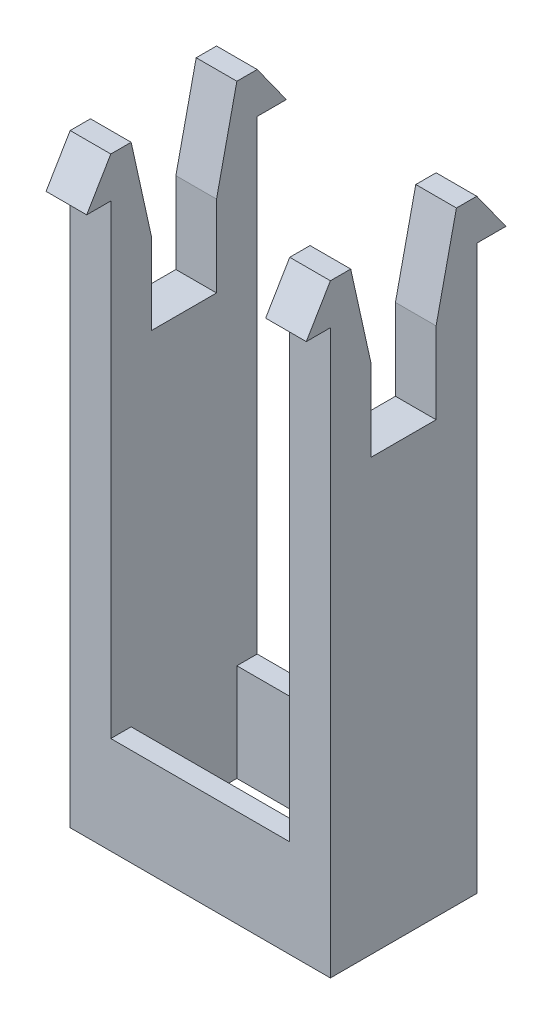
ISO-10303-21;
HEADER;
FILE_DESCRIPTION(('STEP AP214'),'2;1');
FILE_NAME('part.step','',(''),(''),'','','');
FILE_SCHEMA(('AUTOMOTIVE_DESIGN { 1 0 10303 214 1 1 1 1 }'));
ENDSEC;
DATA;
#1=APPLICATION_CONTEXT('core data for automotive mechanical design processes');
#2=APPLICATION_PROTOCOL_DEFINITION('international standard','automotive_design',2000,#1);
#3=PRODUCT_CONTEXT('',#1,'mechanical');
#4=PRODUCT('Part','Part','',(#3));
#5=PRODUCT_RELATED_PRODUCT_CATEGORY('part','',(#4));
#6=PRODUCT_DEFINITION_FORMATION('','',#4);
#7=PRODUCT_DEFINITION_CONTEXT('part definition',#1,'design');
#8=PRODUCT_DEFINITION('design','',#6,#7);
#9=PRODUCT_DEFINITION_SHAPE('','',#8);
#10=(LENGTH_UNIT() NAMED_UNIT(*) SI_UNIT(.MILLI.,.METRE.));
#11=(NAMED_UNIT(*) PLANE_ANGLE_UNIT() SI_UNIT($,.RADIAN.));
#12=(NAMED_UNIT(*) SI_UNIT($,.STERADIAN.) SOLID_ANGLE_UNIT());
#13=UNCERTAINTY_MEASURE_WITH_UNIT(LENGTH_MEASURE(1.E-05),#10,'distance_accuracy_value','');
#14=(GEOMETRIC_REPRESENTATION_CONTEXT(3) GLOBAL_UNCERTAINTY_ASSIGNED_CONTEXT((#13)) GLOBAL_UNIT_ASSIGNED_CONTEXT((#10,
#11,#12)) REPRESENTATION_CONTEXT('',''));
#15=CARTESIAN_POINT('',(0.,0.,0.));
#16=DIRECTION('',(0.,0.,1.));
#17=DIRECTION('',(1.,0.,0.));
#18=AXIS2_PLACEMENT_3D('',#15,#16,#17);
#19=CARTESIAN_POINT('',(-13.5,-2.14223492355593,1.01371710595276));
#20=DIRECTION('',(0.,-1.,0.));
#21=DIRECTION('',(0.,0.,-1.));
#22=AXIS2_PLACEMENT_3D('',#19,#20,#21);
#23=PLANE('',#22);
#24=DIRECTION('',(0.,0.,1.));
#25=VECTOR('',#24,1.);
#26=CARTESIAN_POINT('',(-13.5,-2.14223492355593,1.01371710595276));
#27=LINE('',#26,#25);
#28=CARTESIAN_POINT('',(-13.5,-2.14223492355593,2.80761665905368));
#29=VERTEX_POINT('',#28);
#30=CARTESIAN_POINT('',(-13.5,-2.14223492355593,4.05761665905367));
#31=VERTEX_POINT('',#30);
#32=EDGE_CURVE('E302',#29,#31,#27,.T.);
#33=ORIENTED_EDGE('',*,*,#32,.T.);
#34=DIRECTION('',(-1.,0.,0.));
#35=VECTOR('',#34,1.);
#36=CARTESIAN_POINT('',(-13.5,-2.14223492355593,4.05761665905367));
#37=LINE('',#36,#35);
#38=CARTESIAN_POINT('',(-2.5,-2.14223492355593,4.05761665905367));
#39=VERTEX_POINT('',#38);
#40=EDGE_CURVE('E262',#39,#31,#37,.T.);
#41=ORIENTED_EDGE('',*,*,#40,.F.);
#42=DIRECTION('',(0.,0.,1.));
#43=VECTOR('',#42,1.);
#44=CARTESIAN_POINT('',(-2.5,-2.14223492355593,1.01371710595276));
#45=LINE('',#44,#43);
#46=CARTESIAN_POINT('',(-2.5,-2.14223492355593,2.80761665905368));
#47=VERTEX_POINT('',#46);
#48=EDGE_CURVE('E298',#47,#39,#45,.T.);
#49=ORIENTED_EDGE('',*,*,#48,.F.);
#50=DIRECTION('',(-1.,0.,0.));
#51=VECTOR('',#50,1.);
#52=CARTESIAN_POINT('',(-16.,-2.14223492355593,2.80761665905368));
#53=LINE('',#52,#51);
#54=EDGE_CURVE('E348',#47,#29,#53,.T.);
#55=ORIENTED_EDGE('',*,*,#54,.T.);
#56=EDGE_LOOP('',(#33,#41,#49,#55));
#57=FACE_BOUND('',#56,.T.);
#58=ADVANCED_FACE('F33',(#57),#23,.F.);
#59=CARTESIAN_POINT('',(-16.,26.4827651722441,0.));
#60=DIRECTION('',(0.,1.,0.));
#61=DIRECTION('',(0.,0.,1.));
#62=AXIS2_PLACEMENT_3D('',#59,#60,#61);
#63=PLANE('',#62);
#64=DIRECTION('',(1.,0.,0.));
#65=VECTOR('',#64,1.);
#66=CARTESIAN_POINT('',(-16.,26.4827651722441,1.01371710595276));
#67=LINE('',#66,#65);
#68=CARTESIAN_POINT('',(-16.,26.4827651722441,1.01371710595276));
#69=VERTEX_POINT('',#68);
#70=CARTESIAN_POINT('',(-13.5,26.4827651722441,1.01371710595276));
#71=VERTEX_POINT('',#70);
#72=EDGE_CURVE('E465',#69,#71,#67,.T.);
#73=ORIENTED_EDGE('',*,*,#72,.T.);
#74=DIRECTION('',(0.,0.,1.));
#75=VECTOR('',#74,1.);
#76=CARTESIAN_POINT('',(-13.5,26.4827651722441,0.));
#77=LINE('',#76,#75);
#78=CARTESIAN_POINT('',(-13.5,26.4827651722441,2.80761665905367));
#79=VERTEX_POINT('',#78);
#80=EDGE_CURVE('E326',#71,#79,#77,.T.);
#81=ORIENTED_EDGE('',*,*,#80,.T.);
#82=DIRECTION('',(1.,0.,0.));
#83=VECTOR('',#82,1.);
#84=CARTESIAN_POINT('',(-16.,26.4827651722441,2.80761665905367));
#85=LINE('',#84,#83);
#86=CARTESIAN_POINT('',(-16.,26.4827651722441,2.80761665905367));
#87=VERTEX_POINT('',#86);
#88=EDGE_CURVE('E424',#87,#79,#85,.T.);
#89=ORIENTED_EDGE('',*,*,#88,.F.);
#90=DIRECTION('',(0.,0.,1.));
#91=VECTOR('',#90,1.);
#92=CARTESIAN_POINT('',(-16.,26.4827651722441,0.));
#93=LINE('',#92,#91);
#94=EDGE_CURVE('E351',#69,#87,#93,.T.);
#95=ORIENTED_EDGE('',*,*,#94,.F.);
#96=EDGE_LOOP('',(#73,#81,#89,#95));
#97=FACE_BOUND('',#96,.T.);
#98=ADVANCED_FACE('F525',(#97),#63,.F.);
#99=CARTESIAN_POINT('',(-16.,26.4827651722441,0.));
#100=DIRECTION('',(0.,-1.,0.));
#101=DIRECTION('',(0.,0.,-1.));
#102=AXIS2_PLACEMENT_3D('',#99,#100,#101);
#103=PLANE('',#102);
#104=DIRECTION('',(0.,0.,-1.));
#105=VECTOR('',#104,1.);
#106=CARTESIAN_POINT('',(-13.5,26.4827651722441,0.));
#107=LINE('',#106,#105);
#108=CARTESIAN_POINT('',(-13.5,26.4827651722441,13.2888140391797));
#109=VERTEX_POINT('',#108);
#110=CARTESIAN_POINT('',(-13.5,26.4827651722441,11.8076166590537));
#111=VERTEX_POINT('',#110);
#112=EDGE_CURVE('E343',#109,#111,#107,.T.);
#113=ORIENTED_EDGE('',*,*,#112,.F.);
#114=DIRECTION('',(1.,0.,0.));
#115=VECTOR('',#114,1.);
#116=CARTESIAN_POINT('',(-16.,26.4827651722441,13.2888140391797));
#117=LINE('',#116,#115);
#118=CARTESIAN_POINT('',(-16.,26.4827651722441,13.2888140391797));
#119=VERTEX_POINT('',#118);
#120=EDGE_CURVE('E437',#119,#109,#117,.T.);
#121=ORIENTED_EDGE('',*,*,#120,.F.);
#122=DIRECTION('',(0.,0.,-1.));
#123=VECTOR('',#122,1.);
#124=CARTESIAN_POINT('',(-16.,26.4827651722441,0.));
#125=LINE('',#124,#123);
#126=CARTESIAN_POINT('',(-16.,26.4827651722441,11.8076166590537));
#127=VERTEX_POINT('',#126);
#128=EDGE_CURVE('E375',#119,#127,#125,.T.);
#129=ORIENTED_EDGE('',*,*,#128,.T.);
#130=DIRECTION('',(1.,0.,0.));
#131=VECTOR('',#130,1.);
#132=CARTESIAN_POINT('',(-16.,26.4827651722441,11.8076166590537));
#133=LINE('',#132,#131);
#134=EDGE_CURVE('E433',#127,#111,#133,.T.);
#135=ORIENTED_EDGE('',*,*,#134,.T.);
#136=EDGE_LOOP('',(#113,#121,#129,#135));
#137=FACE_BOUND('',#136,.T.);
#138=ADVANCED_FACE('F484',(#137),#103,.T.);
#139=CARTESIAN_POINT('',(-16.,12.7085303062226,21.4497582778963));
#140=DIRECTION('',(0.,0.509730029609759,0.860334409932576));
#141=DIRECTION('',(0.,-0.860334409932576,0.509730029609759));
#142=AXIS2_PLACEMENT_3D('',#139,#140,#141);
#143=PLANE('',#142);
#144=DIRECTION('',(0.,-0.860334409932576,0.509730029609759));
#145=VECTOR('',#144,1.);
#146=CARTESIAN_POINT('',(-13.5,12.7085303062226,21.4497582778963));
#147=LINE('',#146,#145);
#148=CARTESIAN_POINT('',(-13.5,28.9827651722441,11.8076166590537));
#149=VERTEX_POINT('',#148);
#150=EDGE_CURVE('E341',#149,#109,#147,.T.);
#151=ORIENTED_EDGE('',*,*,#150,.F.);
#152=DIRECTION('',(1.,0.,0.));
#153=VECTOR('',#152,1.);
#154=CARTESIAN_POINT('',(-16.,28.9827651722441,11.8076166590537));
#155=LINE('',#154,#153);
#156=CARTESIAN_POINT('',(-16.,28.9827651722441,11.8076166590537));
#157=VERTEX_POINT('',#156);
#158=EDGE_CURVE('E441',#157,#149,#155,.T.);
#159=ORIENTED_EDGE('',*,*,#158,.F.);
#160=DIRECTION('',(0.,-0.860334409932576,0.509730029609759));
#161=VECTOR('',#160,1.);
#162=CARTESIAN_POINT('',(-16.,12.7085303062226,21.4497582778963));
#163=LINE('',#162,#161);
#164=EDGE_CURVE('E372',#157,#119,#163,.T.);
#165=ORIENTED_EDGE('',*,*,#164,.T.);
#166=ORIENTED_EDGE('',*,*,#120,.T.);
#167=EDGE_LOOP('',(#151,#159,#165,#166));
#168=FACE_BOUND('',#167,.T.);
#169=ADVANCED_FACE('F487',(#168),#143,.T.);
#170=CARTESIAN_POINT('',(-16.,28.9827651722441,0.));
#171=DIRECTION('',(0.,1.,0.));
#172=DIRECTION('',(0.,0.,1.));
#173=AXIS2_PLACEMENT_3D('',#170,#171,#172);
#174=PLANE('',#173);
#175=DIRECTION('',(0.,0.,1.));
#176=VECTOR('',#175,1.);
#177=CARTESIAN_POINT('',(-13.5,28.9827651722441,1.01371710595276));
#178=LINE('',#177,#176);
#179=CARTESIAN_POINT('',(-13.5,28.9827651722441,10.5576166590537));
#180=VERTEX_POINT('',#179);
#181=EDGE_CURVE('E291',#180,#149,#178,.T.);
#182=ORIENTED_EDGE('',*,*,#181,.F.);
#183=DIRECTION('',(1.,0.,0.));
#184=VECTOR('',#183,1.);
#185=CARTESIAN_POINT('',(-16.,28.9827651722441,10.5576166590537));
#186=LINE('',#185,#184);
#187=CARTESIAN_POINT('',(-16.,28.9827651722441,10.5576166590537));
#188=VERTEX_POINT('',#187);
#189=EDGE_CURVE('E445',#188,#180,#186,.T.);
#190=ORIENTED_EDGE('',*,*,#189,.F.);
#191=DIRECTION('',(0.,0.,1.));
#192=VECTOR('',#191,1.);
#193=CARTESIAN_POINT('',(-16.,28.9827651722441,0.));
#194=LINE('',#193,#192);
#195=EDGE_CURVE('E369',#188,#157,#194,.T.);
#196=ORIENTED_EDGE('',*,*,#195,.T.);
#197=ORIENTED_EDGE('',*,*,#158,.T.);
#198=EDGE_LOOP('',(#182,#190,#196,#197));
#199=FACE_BOUND('',#198,.T.);
#200=ADVANCED_FACE('F494',(#199),#174,.T.);
#201=CARTESIAN_POINT('',(-16.,-0.874345158644692,3.95200860426726));
#202=DIRECTION('',(0.,-0.216017115586422,0.976389576846108));
#203=DIRECTION('',(0.,-0.976389576846108,-0.216017115586422));
#204=AXIS2_PLACEMENT_3D('',#201,#202,#203);
#205=PLANE('',#204);
#206=ORIENTED_EDGE('',*,*,#189,.T.);
#207=DIRECTION('',(0.,-0.976389576846108,-0.216017115586422));
#208=VECTOR('',#207,1.);
#209=CARTESIAN_POINT('',(-13.5,-0.874345158644691,3.95200860426726));
#210=LINE('',#209,#208);
#211=CARTESIAN_POINT('',(-13.5,23.3328102242559,9.30761665905367));
#212=VERTEX_POINT('',#211);
#213=EDGE_CURVE('E338',#180,#212,#210,.T.);
#214=ORIENTED_EDGE('',*,*,#213,.T.);
#215=DIRECTION('',(1.,0.,0.));
#216=VECTOR('',#215,1.);
#217=CARTESIAN_POINT('',(-16.,23.3328102242559,9.30761665905367));
#218=LINE('',#217,#216);
#219=CARTESIAN_POINT('',(-16.,23.3328102242559,9.30761665905367));
#220=VERTEX_POINT('',#219);
#221=EDGE_CURVE('E449',#220,#212,#218,.T.);
#222=ORIENTED_EDGE('',*,*,#221,.F.);
#223=DIRECTION('',(0.,-0.976389576846108,-0.216017115586422));
#224=VECTOR('',#223,1.);
#225=CARTESIAN_POINT('',(-16.,-0.874345158644692,3.95200860426726));
#226=LINE('',#225,#224);
#227=EDGE_CURVE('E367',#188,#220,#226,.T.);
#228=ORIENTED_EDGE('',*,*,#227,.F.);
#229=EDGE_LOOP('',(#206,#214,#222,#228));
#230=FACE_BOUND('',#229,.T.);
#231=ADVANCED_FACE('F498',(#230),#205,.F.);
#232=CARTESIAN_POINT('',(-16.,0.,9.30761665905367));
#233=DIRECTION('',(0.,0.,-1.));
#234=DIRECTION('',(-1.,0.,0.));
#235=AXIS2_PLACEMENT_3D('',#232,#233,#234);
#236=PLANE('',#235);
#237=DIRECTION('',(0.,1.,0.));
#238=VECTOR('',#237,1.);
#239=CARTESIAN_POINT('',(-13.5,0.,9.30761665905367));
#240=LINE('',#239,#238);
#241=CARTESIAN_POINT('',(-13.5,18.3328102242559,9.30761665905367));
#242=VERTEX_POINT('',#241);
#243=EDGE_CURVE('E336',#242,#212,#240,.T.);
#244=ORIENTED_EDGE('',*,*,#243,.F.);
#245=DIRECTION('',(1.,0.,0.));
#246=VECTOR('',#245,1.);
#247=CARTESIAN_POINT('',(-16.,18.3328102242559,9.30761665905367));
#248=LINE('',#247,#246);
#249=CARTESIAN_POINT('',(-16.,18.3328102242559,9.30761665905367));
#250=VERTEX_POINT('',#249);
#251=EDGE_CURVE('E284',#250,#242,#248,.T.);
#252=ORIENTED_EDGE('',*,*,#251,.F.);
#253=DIRECTION('',(0.,1.,0.));
#254=VECTOR('',#253,1.);
#255=CARTESIAN_POINT('',(-16.,0.,9.30761665905367));
#256=LINE('',#255,#254);
#257=EDGE_CURVE('E364',#250,#220,#256,.T.);
#258=ORIENTED_EDGE('',*,*,#257,.T.);
#259=ORIENTED_EDGE('',*,*,#221,.T.);
#260=EDGE_LOOP('',(#244,#252,#258,#259));
#261=FACE_BOUND('',#260,.T.);
#262=ADVANCED_FACE('F502',(#261),#236,.T.);
#263=CARTESIAN_POINT('',(-16.,0.,5.30761665905367));
#264=DIRECTION('',(0.,0.,-1.));
#265=DIRECTION('',(-1.,0.,0.));
#266=AXIS2_PLACEMENT_3D('',#263,#264,#265);
#267=PLANE('',#266);
#268=DIRECTION('',(0.,1.,0.));
#269=VECTOR('',#268,1.);
#270=CARTESIAN_POINT('',(-16.,0.,5.30761665905367));
#271=LINE('',#270,#269);
#272=CARTESIAN_POINT('',(-16.,18.3328102242559,5.30761665905367));
#273=VERTEX_POINT('',#272);
#274=CARTESIAN_POINT('',(-16.,23.3328102242559,5.30761665905367));
#275=VERTEX_POINT('',#274);
#276=EDGE_CURVE('E362',#273,#275,#271,.T.);
#277=ORIENTED_EDGE('',*,*,#276,.F.);
#278=DIRECTION('',(1.,0.,0.));
#279=VECTOR('',#278,1.);
#280=CARTESIAN_POINT('',(-16.,18.3328102242559,5.30761665905367));
#281=LINE('',#280,#279);
#282=CARTESIAN_POINT('',(-13.5,18.3328102242559,5.30761665905367));
#283=VERTEX_POINT('',#282);
#284=EDGE_CURVE('E279',#273,#283,#281,.T.);
#285=ORIENTED_EDGE('',*,*,#284,.T.);
#286=DIRECTION('',(0.,1.,0.));
#287=VECTOR('',#286,1.);
#288=CARTESIAN_POINT('',(-13.5,0.,5.30761665905367));
#289=LINE('',#288,#287);
#290=CARTESIAN_POINT('',(-13.5,23.3328102242559,5.30761665905367));
#291=VERTEX_POINT('',#290);
#292=EDGE_CURVE('E333',#283,#291,#289,.T.);
#293=ORIENTED_EDGE('',*,*,#292,.T.);
#294=DIRECTION('',(1.,0.,0.));
#295=VECTOR('',#294,1.);
#296=CARTESIAN_POINT('',(-16.,23.3328102242559,5.30761665905367));
#297=LINE('',#296,#295);
#298=EDGE_CURVE('E453',#275,#291,#297,.T.);
#299=ORIENTED_EDGE('',*,*,#298,.F.);
#300=EDGE_LOOP('',(#277,#285,#293,#299));
#301=FACE_BOUND('',#300,.T.);
#302=ADVANCED_FACE('F508',(#301),#267,.F.);
#303=CARTESIAN_POINT('',(-16.,2.20825396213167,9.98122831980823));
#304=DIRECTION('',(0.,0.216017115586422,0.976389576846108));
#305=DIRECTION('',(0.,-0.976389576846108,0.216017115586422));
#306=AXIS2_PLACEMENT_3D('',#303,#304,#305);
#307=PLANE('',#306);
#308=DIRECTION('',(0.,-0.976389576846108,0.216017115586422));
#309=VECTOR('',#308,1.);
#310=CARTESIAN_POINT('',(-13.5,2.20825396213167,9.98122831980823));
#311=LINE('',#310,#309);
#312=CARTESIAN_POINT('',(-13.5,28.9827651722441,4.05761665905367));
#313=VERTEX_POINT('',#312);
#314=EDGE_CURVE('E331',#313,#291,#311,.T.);
#315=ORIENTED_EDGE('',*,*,#314,.F.);
#316=DIRECTION('',(1.,0.,0.));
#317=VECTOR('',#316,1.);
#318=CARTESIAN_POINT('',(-16.,28.9827651722441,4.05761665905367));
#319=LINE('',#318,#317);
#320=CARTESIAN_POINT('',(-16.,28.9827651722441,4.05761665905367));
#321=VERTEX_POINT('',#320);
#322=EDGE_CURVE('E457',#321,#313,#319,.T.);
#323=ORIENTED_EDGE('',*,*,#322,.F.);
#324=DIRECTION('',(0.,-0.976389576846108,0.216017115586422));
#325=VECTOR('',#324,1.);
#326=CARTESIAN_POINT('',(-16.,2.20825396213167,9.98122831980823));
#327=LINE('',#326,#325);
#328=EDGE_CURVE('E359',#321,#275,#327,.T.);
#329=ORIENTED_EDGE('',*,*,#328,.T.);
#330=ORIENTED_EDGE('',*,*,#298,.T.);
#331=EDGE_LOOP('',(#315,#323,#329,#330));
#332=FACE_BOUND('',#331,.T.);
#333=ADVANCED_FACE('F642',(#332),#307,.T.);
#334=CARTESIAN_POINT('',(-16.,28.9827651722441,0.));
#335=DIRECTION('',(0.,1.,0.));
#336=DIRECTION('',(0.,0.,1.));
#337=AXIS2_PLACEMENT_3D('',#334,#335,#336);
#338=PLANE('',#337);
#339=CARTESIAN_POINT('',(-13.5,28.9827651722441,2.80761665905367));
#340=VERTEX_POINT('',#339);
#341=EDGE_CURVE('E293',#340,#313,#178,.T.);
#342=ORIENTED_EDGE('',*,*,#341,.F.);
#343=DIRECTION('',(1.,0.,0.));
#344=VECTOR('',#343,1.);
#345=CARTESIAN_POINT('',(-16.,28.9827651722441,2.80761665905367));
#346=LINE('',#345,#344);
#347=CARTESIAN_POINT('',(-16.,28.9827651722441,2.80761665905367));
#348=VERTEX_POINT('',#347);
#349=EDGE_CURVE('E461',#348,#340,#346,.T.);
#350=ORIENTED_EDGE('',*,*,#349,.F.);
#351=DIRECTION('',(0.,0.,1.));
#352=VECTOR('',#351,1.);
#353=CARTESIAN_POINT('',(-16.,28.9827651722441,0.));
#354=LINE('',#353,#352);
#355=EDGE_CURVE('E356',#348,#321,#354,.T.);
#356=ORIENTED_EDGE('',*,*,#355,.T.);
#357=ORIENTED_EDGE('',*,*,#322,.T.);
#358=EDGE_LOOP('',(#342,#350,#356,#357));
#359=FACE_BOUND('',#358,.T.);
#360=ADVANCED_FACE('F515',(#359),#338,.T.);
#361=CARTESIAN_POINT('',(-16.,8.52097905532236,-11.8749389292632));
#362=DIRECTION('',(0.,-0.582998265973011,0.812473397639863));
#363=DIRECTION('',(0.,-0.812473397639863,-0.582998265973011));
#364=AXIS2_PLACEMENT_3D('',#361,#362,#363);
#365=PLANE('',#364);
#366=ORIENTED_EDGE('',*,*,#349,.T.);
#367=DIRECTION('',(0.,-0.812473397639863,-0.582998265973011));
#368=VECTOR('',#367,1.);
#369=CARTESIAN_POINT('',(-13.5,8.52097905532236,-11.8749389292632));
#370=LINE('',#369,#368);
#371=EDGE_CURVE('E470',#340,#71,#370,.T.);
#372=ORIENTED_EDGE('',*,*,#371,.T.);
#373=ORIENTED_EDGE('',*,*,#72,.F.);
#374=DIRECTION('',(0.,-0.812473397639863,-0.582998265973011));
#375=VECTOR('',#374,1.);
#376=CARTESIAN_POINT('',(-16.,8.52097905532236,-11.8749389292632));
#377=LINE('',#376,#375);
#378=EDGE_CURVE('E353',#348,#69,#377,.T.);
#379=ORIENTED_EDGE('',*,*,#378,.F.);
#380=EDGE_LOOP('',(#366,#372,#373,#379));
#381=FACE_BOUND('',#380,.T.);
#382=ADVANCED_FACE('F519',(#381),#365,.F.);
#383=CARTESIAN_POINT('',(-2.5,26.4827651722441,2.80761665905367));
#384=VERTEX_POINT('',#383);
#385=CARTESIAN_POINT('',(0.,26.4827651722441,2.80761665905367));
#386=VERTEX_POINT('',#385);
#387=EDGE_CURVE('E428',#384,#386,#85,.T.);
#388=ORIENTED_EDGE('',*,*,#387,.F.);
#389=DIRECTION('',(0.,0.,-1.));
#390=VECTOR('',#389,1.);
#391=CARTESIAN_POINT('',(-2.5,26.4827651722441,0.));
#392=LINE('',#391,#390);
#393=CARTESIAN_POINT('',(-2.5,26.4827651722441,1.01371710595276));
#394=VERTEX_POINT('',#393);
#395=EDGE_CURVE('E305',#384,#394,#392,.T.);
#396=ORIENTED_EDGE('',*,*,#395,.T.);
#397=CARTESIAN_POINT('',(0.,26.4827651722441,1.01371710595276));
#398=VERTEX_POINT('',#397);
#399=EDGE_CURVE('E386',#394,#398,#67,.T.);
#400=ORIENTED_EDGE('',*,*,#399,.T.);
#401=DIRECTION('',(0.,0.,1.));
#402=VECTOR('',#401,1.);
#403=CARTESIAN_POINT('',(0.,26.4827651722441,0.));
#404=LINE('',#403,#402);
#405=EDGE_CURVE('E350',#398,#386,#404,.T.);
#406=ORIENTED_EDGE('',*,*,#405,.T.);
#407=EDGE_LOOP('',(#388,#396,#400,#406));
#408=FACE_BOUND('',#407,.T.);
#409=ADVANCED_FACE('F35',(#408),#63,.F.);
#410=CARTESIAN_POINT('',(-16.,0.,2.80761665905368));
#411=DIRECTION('',(0.,0.,-1.));
#412=DIRECTION('',(0.,1.,0.));
#413=AXIS2_PLACEMENT_3D('',#410,#411,#412);
#414=PLANE('',#413);
#415=DIRECTION('',(0.,1.,0.));
#416=VECTOR('',#415,1.);
#417=CARTESIAN_POINT('',(-13.5,0.,2.80761665905368));
#418=LINE('',#417,#416);
#419=EDGE_CURVE('E329',#29,#79,#418,.T.);
#420=ORIENTED_EDGE('',*,*,#419,.F.);
#421=ORIENTED_EDGE('',*,*,#54,.F.);
#422=DIRECTION('',(0.,-1.,0.));
#423=VECTOR('',#422,1.);
#424=CARTESIAN_POINT('',(-2.5,0.,2.80761665905368));
#425=LINE('',#424,#423);
#426=EDGE_CURVE('E308',#384,#47,#425,.T.);
#427=ORIENTED_EDGE('',*,*,#426,.F.);
#428=ORIENTED_EDGE('',*,*,#387,.T.);
#429=DIRECTION('',(0.,1.,0.));
#430=VECTOR('',#429,1.);
#431=CARTESIAN_POINT('',(0.,0.,2.80761665905368));
#432=LINE('',#431,#430);
#433=CARTESIAN_POINT('',(0.,-8.14223492355593,2.80761665905367));
#434=VERTEX_POINT('',#433);
#435=EDGE_CURVE('E354',#434,#386,#432,.T.);
#436=ORIENTED_EDGE('',*,*,#435,.F.);
#437=DIRECTION('',(1.,0.,0.));
#438=VECTOR('',#437,1.);
#439=CARTESIAN_POINT('',(-16.,-8.14223492355593,2.80761665905367));
#440=LINE('',#439,#438);
#441=CARTESIAN_POINT('',(-16.,-8.14223492355593,2.80761665905367));
#442=VERTEX_POINT('',#441);
#443=EDGE_CURVE('E429',#442,#434,#440,.T.);
#444=ORIENTED_EDGE('',*,*,#443,.F.);
#445=DIRECTION('',(0.,1.,0.));
#446=VECTOR('',#445,1.);
#447=CARTESIAN_POINT('',(-16.,0.,2.80761665905368));
#448=LINE('',#447,#446);
#449=EDGE_CURVE('E383',#442,#87,#448,.T.);
#450=ORIENTED_EDGE('',*,*,#449,.T.);
#451=ORIENTED_EDGE('',*,*,#88,.T.);
#452=EDGE_LOOP('',(#420,#421,#427,#428,#436,#444,#450,#451));
#453=FACE_BOUND('',#452,.T.);
#454=ADVANCED_FACE('F528',(#453),#414,.T.);
#455=CARTESIAN_POINT('',(-16.,-8.14223492355593,0.));
#456=DIRECTION('',(0.,-1.,0.));
#457=DIRECTION('',(0.,0.,-1.));
#458=AXIS2_PLACEMENT_3D('',#455,#456,#457);
#459=PLANE('',#458);
#460=DIRECTION('',(0.,0.,1.));
#461=VECTOR('',#460,1.);
#462=CARTESIAN_POINT('',(-13.5,-8.14223492355593,10.5576166590537));
#463=LINE('',#462,#461);
#464=CARTESIAN_POINT('',(-13.5,-8.14223492355593,4.05761665905367));
#465=VERTEX_POINT('',#464);
#466=CARTESIAN_POINT('',(-13.5,-8.14223492355593,10.5576166590537));
#467=VERTEX_POINT('',#466);
#468=EDGE_CURVE('E247',#465,#467,#463,.T.);
#469=ORIENTED_EDGE('',*,*,#468,.T.);
#470=DIRECTION('',(1.,0.,0.));
#471=VECTOR('',#470,1.);
#472=CARTESIAN_POINT('',(-13.5,-8.14223492355593,10.5576166590537));
#473=LINE('',#472,#471);
#474=CARTESIAN_POINT('',(-2.5,-8.14223492355593,10.5576166590537));
#475=VERTEX_POINT('',#474);
#476=EDGE_CURVE('E255',#467,#475,#473,.T.);
#477=ORIENTED_EDGE('',*,*,#476,.T.);
#478=DIRECTION('',(0.,0.,-1.));
#479=VECTOR('',#478,1.);
#480=CARTESIAN_POINT('',(-2.5,-8.14223492355593,10.5576166590537));
#481=LINE('',#480,#479);
#482=CARTESIAN_POINT('',(-2.5,-8.14223492355593,4.05761665905367));
#483=VERTEX_POINT('',#482);
#484=EDGE_CURVE('E48',#475,#483,#481,.T.);
#485=ORIENTED_EDGE('',*,*,#484,.T.);
#486=DIRECTION('',(-1.,0.,0.));
#487=VECTOR('',#486,1.);
#488=CARTESIAN_POINT('',(-13.5,-8.14223492355593,4.05761665905367));
#489=LINE('',#488,#487);
#490=EDGE_CURVE('E252',#483,#465,#489,.T.);
#491=ORIENTED_EDGE('',*,*,#490,.T.);
#492=EDGE_LOOP('',(#469,#477,#485,#491));
#493=FACE_BOUND('',#492,.T.);
#494=DIRECTION('',(0.,0.,-1.));
#495=VECTOR('',#494,1.);
#496=CARTESIAN_POINT('',(0.,-8.14223492355593,0.));
#497=LINE('',#496,#495);
#498=CARTESIAN_POINT('',(0.,-8.14223492355593,11.8076166590537));
#499=VERTEX_POINT('',#498);
#500=EDGE_CURVE('E419',#499,#434,#497,.T.);
#501=ORIENTED_EDGE('',*,*,#500,.F.);
#502=DIRECTION('',(1.,0.,0.));
#503=VECTOR('',#502,1.);
#504=CARTESIAN_POINT('',(-16.,-8.14223492355593,11.8076166590537));
#505=LINE('',#504,#503);
#506=CARTESIAN_POINT('',(-16.,-8.14223492355593,11.8076166590537));
#507=VERTEX_POINT('',#506);
#508=EDGE_CURVE('E431',#507,#499,#505,.T.);
#509=ORIENTED_EDGE('',*,*,#508,.F.);
#510=DIRECTION('',(0.,0.,-1.));
#511=VECTOR('',#510,1.);
#512=CARTESIAN_POINT('',(-16.,-8.14223492355593,0.));
#513=LINE('',#512,#511);
#514=EDGE_CURVE('E380',#507,#442,#513,.T.);
#515=ORIENTED_EDGE('',*,*,#514,.T.);
#516=ORIENTED_EDGE('',*,*,#443,.T.);
#517=EDGE_LOOP('',(#501,#509,#515,#516));
#518=FACE_BOUND('',#517,.T.);
#519=ADVANCED_FACE('F259',(#493,#518),#459,.T.);
#520=CARTESIAN_POINT('',(-16.,0.,11.8076166590537));
#521=DIRECTION('',(0.,0.,-1.));
#522=DIRECTION('',(-1.,0.,0.));
#523=AXIS2_PLACEMENT_3D('',#520,#521,#522);
#524=PLANE('',#523);
#525=DIRECTION('',(-1.,0.,0.));
#526=VECTOR('',#525,1.);
#527=CARTESIAN_POINT('',(-16.,-2.14223492355593,11.8076166590537));
#528=LINE('',#527,#526);
#529=CARTESIAN_POINT('',(-2.5,-2.14223492355593,11.8076166590537));
#530=VERTEX_POINT('',#529);
#531=CARTESIAN_POINT('',(-13.5,-2.14223492355593,11.8076166590537));
#532=VERTEX_POINT('',#531);
#533=EDGE_CURVE('E41',#530,#532,#528,.T.);
#534=ORIENTED_EDGE('',*,*,#533,.T.);
#535=DIRECTION('',(0.,1.,0.));
#536=VECTOR('',#535,1.);
#537=CARTESIAN_POINT('',(-13.5,0.,11.8076166590537));
#538=LINE('',#537,#536);
#539=EDGE_CURVE('E345',#532,#111,#538,.T.);
#540=ORIENTED_EDGE('',*,*,#539,.T.);
#541=ORIENTED_EDGE('',*,*,#134,.F.);
#542=DIRECTION('',(0.,1.,0.));
#543=VECTOR('',#542,1.);
#544=CARTESIAN_POINT('',(-16.,0.,11.8076166590537));
#545=LINE('',#544,#543);
#546=EDGE_CURVE('E378',#507,#127,#545,.T.);
#547=ORIENTED_EDGE('',*,*,#546,.F.);
#548=ORIENTED_EDGE('',*,*,#508,.T.);
#549=DIRECTION('',(0.,1.,0.));
#550=VECTOR('',#549,1.);
#551=CARTESIAN_POINT('',(0.,0.,11.8076166590537));
#552=LINE('',#551,#550);
#553=CARTESIAN_POINT('',(0.,26.4827651722441,11.8076166590537));
#554=VERTEX_POINT('',#553);
#555=EDGE_CURVE('E416',#499,#554,#552,.T.);
#556=ORIENTED_EDGE('',*,*,#555,.T.);
#557=CARTESIAN_POINT('',(-2.5,26.4827651722441,11.8076166590537));
#558=VERTEX_POINT('',#557);
#559=EDGE_CURVE('E436',#558,#554,#133,.T.);
#560=ORIENTED_EDGE('',*,*,#559,.F.);
#561=DIRECTION('',(0.,-1.,0.));
#562=VECTOR('',#561,1.);
#563=CARTESIAN_POINT('',(-2.5,0.,11.8076166590537));
#564=LINE('',#563,#562);
#565=EDGE_CURVE('E323',#558,#530,#564,.T.);
#566=ORIENTED_EDGE('',*,*,#565,.T.);
#567=EDGE_LOOP('',(#534,#540,#541,#547,#548,#556,#560,#566));
#568=FACE_BOUND('',#567,.T.);
#569=ADVANCED_FACE('F475',(#568),#524,.F.);
#570=DIRECTION('',(0.,0.,1.));
#571=VECTOR('',#570,1.);
#572=CARTESIAN_POINT('',(-2.5,26.4827651722441,0.));
#573=LINE('',#572,#571);
#574=CARTESIAN_POINT('',(-2.5,26.4827651722441,13.2888140391797));
#575=VERTEX_POINT('',#574);
#576=EDGE_CURVE('E321',#558,#575,#573,.T.);
#577=ORIENTED_EDGE('',*,*,#576,.F.);
#578=ORIENTED_EDGE('',*,*,#559,.T.);
#579=DIRECTION('',(0.,0.,-1.));
#580=VECTOR('',#579,1.);
#581=CARTESIAN_POINT('',(0.,26.4827651722441,0.));
#582=LINE('',#581,#580);
#583=CARTESIAN_POINT('',(0.,26.4827651722441,13.2888140391797));
#584=VERTEX_POINT('',#583);
#585=EDGE_CURVE('E413',#584,#554,#582,.T.);
#586=ORIENTED_EDGE('',*,*,#585,.F.);
#587=EDGE_CURVE('E440',#575,#584,#117,.T.);
#588=ORIENTED_EDGE('',*,*,#587,.F.);
#589=EDGE_LOOP('',(#577,#578,#586,#588));
#590=FACE_BOUND('',#589,.T.);
#591=ADVANCED_FACE('F541',(#590),#103,.T.);
#592=DIRECTION('',(0.,0.860334409932576,-0.509730029609759));
#593=VECTOR('',#592,1.);
#594=CARTESIAN_POINT('',(-2.5,12.7085303062226,21.4497582778963));
#595=LINE('',#594,#593);
#596=CARTESIAN_POINT('',(-2.5,28.9827651722441,11.8076166590537));
#597=VERTEX_POINT('',#596);
#598=EDGE_CURVE('E319',#575,#597,#595,.T.);
#599=ORIENTED_EDGE('',*,*,#598,.F.);
#600=ORIENTED_EDGE('',*,*,#587,.T.);
#601=DIRECTION('',(0.,-0.860334409932576,0.509730029609759));
#602=VECTOR('',#601,1.);
#603=CARTESIAN_POINT('',(0.,12.7085303062226,21.4497582778963));
#604=LINE('',#603,#602);
#605=CARTESIAN_POINT('',(0.,28.9827651722441,11.8076166590537));
#606=VERTEX_POINT('',#605);
#607=EDGE_CURVE('E410',#606,#584,#604,.T.);
#608=ORIENTED_EDGE('',*,*,#607,.F.);
#609=EDGE_CURVE('E444',#597,#606,#155,.T.);
#610=ORIENTED_EDGE('',*,*,#609,.F.);
#611=EDGE_LOOP('',(#599,#600,#608,#610));
#612=FACE_BOUND('',#611,.T.);
#613=ADVANCED_FACE('F546',(#612),#143,.T.);
#614=DIRECTION('',(0.,0.,1.));
#615=VECTOR('',#614,1.);
#616=CARTESIAN_POINT('',(-2.5,28.9827651722441,1.01371710595276));
#617=LINE('',#616,#615);
#618=CARTESIAN_POINT('',(-2.5,28.9827651722441,10.5576166590537));
#619=VERTEX_POINT('',#618);
#620=EDGE_CURVE('E295',#619,#597,#617,.T.);
#621=ORIENTED_EDGE('',*,*,#620,.T.);
#622=ORIENTED_EDGE('',*,*,#609,.T.);
#623=DIRECTION('',(0.,0.,1.));
#624=VECTOR('',#623,1.);
#625=CARTESIAN_POINT('',(0.,28.9827651722441,0.));
#626=LINE('',#625,#624);
#627=CARTESIAN_POINT('',(0.,28.9827651722441,10.5576166590537));
#628=VERTEX_POINT('',#627);
#629=EDGE_CURVE('E407',#628,#606,#626,.T.);
#630=ORIENTED_EDGE('',*,*,#629,.F.);
#631=EDGE_CURVE('E448',#619,#628,#186,.T.);
#632=ORIENTED_EDGE('',*,*,#631,.F.);
#633=EDGE_LOOP('',(#621,#622,#630,#632));
#634=FACE_BOUND('',#633,.T.);
#635=ADVANCED_FACE('F549',(#634),#174,.T.);
#636=CARTESIAN_POINT('',(-2.5,23.3328102242559,9.30761665905367));
#637=VERTEX_POINT('',#636);
#638=CARTESIAN_POINT('',(0.,23.3328102242559,9.30761665905367));
#639=VERTEX_POINT('',#638);
#640=EDGE_CURVE('E452',#637,#639,#218,.T.);
#641=ORIENTED_EDGE('',*,*,#640,.F.);
#642=DIRECTION('',(0.,0.976389576846108,0.216017115586422));
#643=VECTOR('',#642,1.);
#644=CARTESIAN_POINT('',(-2.5,-0.87434515864469,3.95200860426726));
#645=LINE('',#644,#643);
#646=EDGE_CURVE('E316',#637,#619,#645,.T.);
#647=ORIENTED_EDGE('',*,*,#646,.T.);
#648=ORIENTED_EDGE('',*,*,#631,.T.);
#649=DIRECTION('',(0.,-0.976389576846108,-0.216017115586422));
#650=VECTOR('',#649,1.);
#651=CARTESIAN_POINT('',(0.,-0.874345158644692,3.95200860426726));
#652=LINE('',#651,#650);
#653=EDGE_CURVE('E404',#628,#639,#652,.T.);
#654=ORIENTED_EDGE('',*,*,#653,.T.);
#655=EDGE_LOOP('',(#641,#647,#648,#654));
#656=FACE_BOUND('',#655,.T.);
#657=ADVANCED_FACE('F554',(#656),#205,.F.);
#658=DIRECTION('',(0.,-1.,0.));
#659=VECTOR('',#658,1.);
#660=CARTESIAN_POINT('',(-2.5,0.,9.30761665905367));
#661=LINE('',#660,#659);
#662=CARTESIAN_POINT('',(-2.5,18.3328102242559,9.30761665905367));
#663=VERTEX_POINT('',#662);
#664=EDGE_CURVE('E314',#637,#663,#661,.T.);
#665=ORIENTED_EDGE('',*,*,#664,.F.);
#666=ORIENTED_EDGE('',*,*,#640,.T.);
#667=DIRECTION('',(0.,1.,0.));
#668=VECTOR('',#667,1.);
#669=CARTESIAN_POINT('',(0.,0.,9.30761665905367));
#670=LINE('',#669,#668);
#671=CARTESIAN_POINT('',(0.,18.3328102242559,9.30761665905367));
#672=VERTEX_POINT('',#671);
#673=EDGE_CURVE('E401',#672,#639,#670,.T.);
#674=ORIENTED_EDGE('',*,*,#673,.F.);
#675=EDGE_CURVE('E278',#663,#672,#248,.T.);
#676=ORIENTED_EDGE('',*,*,#675,.F.);
#677=EDGE_LOOP('',(#665,#666,#674,#676));
#678=FACE_BOUND('',#677,.T.);
#679=ADVANCED_FACE('F557',(#678),#236,.T.);
#680=CARTESIAN_POINT('',(-2.5,23.3328102242559,5.30761665905367));
#681=VERTEX_POINT('',#680);
#682=CARTESIAN_POINT('',(0.,23.3328102242559,5.30761665905367));
#683=VERTEX_POINT('',#682);
#684=EDGE_CURVE('E456',#681,#683,#297,.T.);
#685=ORIENTED_EDGE('',*,*,#684,.F.);
#686=DIRECTION('',(0.,-1.,0.));
#687=VECTOR('',#686,1.);
#688=CARTESIAN_POINT('',(-2.5,0.,5.30761665905367));
#689=LINE('',#688,#687);
#690=CARTESIAN_POINT('',(-2.5,18.3328102242559,5.30761665905367));
#691=VERTEX_POINT('',#690);
#692=EDGE_CURVE('E312',#681,#691,#689,.T.);
#693=ORIENTED_EDGE('',*,*,#692,.T.);
#694=CARTESIAN_POINT('',(0.,18.3328102242559,5.30761665905367));
#695=VERTEX_POINT('',#694);
#696=EDGE_CURVE('E283',#691,#695,#281,.T.);
#697=ORIENTED_EDGE('',*,*,#696,.T.);
#698=DIRECTION('',(0.,1.,0.));
#699=VECTOR('',#698,1.);
#700=CARTESIAN_POINT('',(0.,0.,5.30761665905367));
#701=LINE('',#700,#699);
#702=EDGE_CURVE('E398',#695,#683,#701,.T.);
#703=ORIENTED_EDGE('',*,*,#702,.T.);
#704=EDGE_LOOP('',(#685,#693,#697,#703));
#705=FACE_BOUND('',#704,.T.);
#706=ADVANCED_FACE('F567',(#705),#267,.F.);
#707=DIRECTION('',(0.,0.976389576846108,-0.216017115586422));
#708=VECTOR('',#707,1.);
#709=CARTESIAN_POINT('',(-2.5,2.20825396213167,9.98122831980823));
#710=LINE('',#709,#708);
#711=CARTESIAN_POINT('',(-2.5,28.9827651722441,4.05761665905367));
#712=VERTEX_POINT('',#711);
#713=EDGE_CURVE('E310',#681,#712,#710,.T.);
#714=ORIENTED_EDGE('',*,*,#713,.F.);
#715=ORIENTED_EDGE('',*,*,#684,.T.);
#716=DIRECTION('',(0.,-0.976389576846108,0.216017115586422));
#717=VECTOR('',#716,1.);
#718=CARTESIAN_POINT('',(0.,2.20825396213167,9.98122831980823));
#719=LINE('',#718,#717);
#720=CARTESIAN_POINT('',(0.,28.9827651722441,4.05761665905367));
#721=VERTEX_POINT('',#720);
#722=EDGE_CURVE('E395',#721,#683,#719,.T.);
#723=ORIENTED_EDGE('',*,*,#722,.F.);
#724=EDGE_CURVE('E460',#712,#721,#319,.T.);
#725=ORIENTED_EDGE('',*,*,#724,.F.);
#726=EDGE_LOOP('',(#714,#715,#723,#725));
#727=FACE_BOUND('',#726,.T.);
#728=ADVANCED_FACE('F572',(#727),#307,.T.);
#729=CARTESIAN_POINT('',(-2.5,28.9827651722441,2.80761665905367));
#730=VERTEX_POINT('',#729);
#731=EDGE_CURVE('E294',#730,#712,#617,.T.);
#732=ORIENTED_EDGE('',*,*,#731,.T.);
#733=ORIENTED_EDGE('',*,*,#724,.T.);
#734=DIRECTION('',(0.,0.,1.));
#735=VECTOR('',#734,1.);
#736=CARTESIAN_POINT('',(0.,28.9827651722441,0.));
#737=LINE('',#736,#735);
#738=CARTESIAN_POINT('',(0.,28.9827651722441,2.80761665905367));
#739=VERTEX_POINT('',#738);
#740=EDGE_CURVE('E392',#739,#721,#737,.T.);
#741=ORIENTED_EDGE('',*,*,#740,.F.);
#742=EDGE_CURVE('E464',#730,#739,#346,.T.);
#743=ORIENTED_EDGE('',*,*,#742,.F.);
#744=EDGE_LOOP('',(#732,#733,#741,#743));
#745=FACE_BOUND('',#744,.T.);
#746=ADVANCED_FACE('F576',(#745),#338,.T.);
#747=ORIENTED_EDGE('',*,*,#399,.F.);
#748=DIRECTION('',(0.,0.812473397639863,0.582998265973011));
#749=VECTOR('',#748,1.);
#750=CARTESIAN_POINT('',(-2.5,8.52097905532236,-11.8749389292632));
#751=LINE('',#750,#749);
#752=EDGE_CURVE('E427',#394,#730,#751,.T.);
#753=ORIENTED_EDGE('',*,*,#752,.T.);
#754=ORIENTED_EDGE('',*,*,#742,.T.);
#755=DIRECTION('',(0.,-0.812473397639863,-0.582998265973011));
#756=VECTOR('',#755,1.);
#757=CARTESIAN_POINT('',(0.,8.52097905532236,-11.8749389292632));
#758=LINE('',#757,#756);
#759=EDGE_CURVE('E389',#739,#398,#758,.T.);
#760=ORIENTED_EDGE('',*,*,#759,.T.);
#761=EDGE_LOOP('',(#747,#753,#754,#760));
#762=FACE_BOUND('',#761,.T.);
#763=ADVANCED_FACE('F580',(#762),#365,.F.);
#764=CARTESIAN_POINT('',(-16.,0.,0.));
#765=DIRECTION('',(1.,0.,0.));
#766=DIRECTION('',(0.,0.,-1.));
#767=AXIS2_PLACEMENT_3D('',#764,#765,#766);
#768=PLANE('',#767);
#769=ORIENTED_EDGE('',*,*,#257,.F.);
#770=DIRECTION('',(0.,0.,-1.));
#771=VECTOR('',#770,1.);
#772=CARTESIAN_POINT('',(-16.,18.3328102242559,9.30761665905367));
#773=LINE('',#772,#771);
#774=EDGE_CURVE('E272',#250,#273,#773,.T.);
#775=ORIENTED_EDGE('',*,*,#774,.T.);
#776=ORIENTED_EDGE('',*,*,#276,.T.);
#777=ORIENTED_EDGE('',*,*,#328,.F.);
#778=ORIENTED_EDGE('',*,*,#355,.F.);
#779=ORIENTED_EDGE('',*,*,#378,.T.);
#780=ORIENTED_EDGE('',*,*,#94,.T.);
#781=ORIENTED_EDGE('',*,*,#449,.F.);
#782=ORIENTED_EDGE('',*,*,#514,.F.);
#783=ORIENTED_EDGE('',*,*,#546,.T.);
#784=ORIENTED_EDGE('',*,*,#128,.F.);
#785=ORIENTED_EDGE('',*,*,#164,.F.);
#786=ORIENTED_EDGE('',*,*,#195,.F.);
#787=ORIENTED_EDGE('',*,*,#227,.T.);
#788=EDGE_LOOP('',(#769,#775,#776,#777,#778,#779,#780,#781,#782,#783,#784,#785,#786,#787));
#789=FACE_BOUND('',#788,.T.);
#790=ADVANCED_FACE('F491',(#789),#768,.F.);
#791=CARTESIAN_POINT('',(0.,0.,0.));
#792=DIRECTION('',(1.,0.,0.));
#793=DIRECTION('',(0.,0.,-1.));
#794=AXIS2_PLACEMENT_3D('',#791,#792,#793);
#795=PLANE('',#794);
#796=DIRECTION('',(0.,0.,-1.));
#797=VECTOR('',#796,1.);
#798=CARTESIAN_POINT('',(0.,18.3328102242559,0.));
#799=LINE('',#798,#797);
#800=EDGE_CURVE('E288',#672,#695,#799,.T.);
#801=ORIENTED_EDGE('',*,*,#800,.F.);
#802=ORIENTED_EDGE('',*,*,#673,.T.);
#803=ORIENTED_EDGE('',*,*,#653,.F.);
#804=ORIENTED_EDGE('',*,*,#629,.T.);
#805=ORIENTED_EDGE('',*,*,#607,.T.);
#806=ORIENTED_EDGE('',*,*,#585,.T.);
#807=ORIENTED_EDGE('',*,*,#555,.F.);
#808=ORIENTED_EDGE('',*,*,#500,.T.);
#809=ORIENTED_EDGE('',*,*,#435,.T.);
#810=ORIENTED_EDGE('',*,*,#405,.F.);
#811=ORIENTED_EDGE('',*,*,#759,.F.);
#812=ORIENTED_EDGE('',*,*,#740,.T.);
#813=ORIENTED_EDGE('',*,*,#722,.T.);
#814=ORIENTED_EDGE('',*,*,#702,.F.);
#815=EDGE_LOOP('',(#801,#802,#803,#804,#805,#806,#807,#808,#809,#810,#811,#812,#813,#814));
#816=FACE_BOUND('',#815,.T.);
#817=ADVANCED_FACE('F535',(#816),#795,.T.);
#818=CARTESIAN_POINT('',(-2.5,-2.14223492355593,10.5576166590537));
#819=VERTEX_POINT('',#818);
#820=EDGE_CURVE('E301',#819,#530,#45,.T.);
#821=ORIENTED_EDGE('',*,*,#820,.F.);
#822=DIRECTION('',(1.,0.,0.));
#823=VECTOR('',#822,1.);
#824=CARTESIAN_POINT('',(-13.5,-2.14223492355593,10.5576166590537));
#825=LINE('',#824,#823);
#826=CARTESIAN_POINT('',(-13.5,-2.14223492355593,10.5576166590537));
#827=VERTEX_POINT('',#826);
#828=EDGE_CURVE('E55',#827,#819,#825,.T.);
#829=ORIENTED_EDGE('',*,*,#828,.F.);
#830=EDGE_CURVE('E250',#827,#532,#27,.T.);
#831=ORIENTED_EDGE('',*,*,#830,.T.);
#832=ORIENTED_EDGE('',*,*,#533,.F.);
#833=EDGE_LOOP('',(#821,#829,#831,#832));
#834=FACE_BOUND('',#833,.T.);
#835=ADVANCED_FACE('F480',(#834),#23,.F.);
#836=CARTESIAN_POINT('',(-13.5,28.9827651722441,1.01371710595276));
#837=DIRECTION('',(-1.,0.,0.));
#838=DIRECTION('',(0.,-1.,0.));
#839=AXIS2_PLACEMENT_3D('',#836,#837,#838);
#840=PLANE('',#839);
#841=DIRECTION('',(0.,0.,1.));
#842=VECTOR('',#841,1.);
#843=CARTESIAN_POINT('',(-13.5,18.3328102242559,1.01371710595276));
#844=LINE('',#843,#842);
#845=EDGE_CURVE('E282',#283,#242,#844,.T.);
#846=ORIENTED_EDGE('',*,*,#845,.T.);
#847=ORIENTED_EDGE('',*,*,#243,.T.);
#848=ORIENTED_EDGE('',*,*,#213,.F.);
#849=ORIENTED_EDGE('',*,*,#181,.T.);
#850=ORIENTED_EDGE('',*,*,#150,.T.);
#851=ORIENTED_EDGE('',*,*,#112,.T.);
#852=ORIENTED_EDGE('',*,*,#539,.F.);
#853=ORIENTED_EDGE('',*,*,#830,.F.);
#854=DIRECTION('',(0.,1.,0.));
#855=VECTOR('',#854,1.);
#856=CARTESIAN_POINT('',(-13.5,-8.14223492355593,10.5576166590537));
#857=LINE('',#856,#855);
#858=EDGE_CURVE('E242',#467,#827,#857,.T.);
#859=ORIENTED_EDGE('',*,*,#858,.F.);
#860=ORIENTED_EDGE('',*,*,#468,.F.);
#861=DIRECTION('',(0.,1.,0.));
#862=VECTOR('',#861,1.);
#863=CARTESIAN_POINT('',(-13.5,-8.14223492355593,4.05761665905367));
#864=LINE('',#863,#862);
#865=EDGE_CURVE('E270',#465,#31,#864,.T.);
#866=ORIENTED_EDGE('',*,*,#865,.T.);
#867=ORIENTED_EDGE('',*,*,#32,.F.);
#868=ORIENTED_EDGE('',*,*,#419,.T.);
#869=ORIENTED_EDGE('',*,*,#80,.F.);
#870=ORIENTED_EDGE('',*,*,#371,.F.);
#871=ORIENTED_EDGE('',*,*,#341,.T.);
#872=ORIENTED_EDGE('',*,*,#314,.T.);
#873=ORIENTED_EDGE('',*,*,#292,.F.);
#874=EDGE_LOOP('',(#846,#847,#848,#849,#850,#851,#852,#853,#859,#860,#866,#867,#868,#869,#870,
#871,#872,#873));
#875=FACE_BOUND('',#874,.T.);
#876=ADVANCED_FACE('F245',(#875),#840,.F.);
#877=CARTESIAN_POINT('',(-2.5,28.9827651722441,1.01371710595276));
#878=DIRECTION('',(1.,0.,0.));
#879=DIRECTION('',(0.,1.,0.));
#880=AXIS2_PLACEMENT_3D('',#877,#878,#879);
#881=PLANE('',#880);
#882=ORIENTED_EDGE('',*,*,#664,.T.);
#883=DIRECTION('',(0.,0.,-1.));
#884=VECTOR('',#883,1.);
#885=CARTESIAN_POINT('',(-2.5,18.3328102242559,1.01371710595276));
#886=LINE('',#885,#884);
#887=EDGE_CURVE('E11',#663,#691,#886,.T.);
#888=ORIENTED_EDGE('',*,*,#887,.T.);
#889=ORIENTED_EDGE('',*,*,#692,.F.);
#890=ORIENTED_EDGE('',*,*,#713,.T.);
#891=ORIENTED_EDGE('',*,*,#731,.F.);
#892=ORIENTED_EDGE('',*,*,#752,.F.);
#893=ORIENTED_EDGE('',*,*,#395,.F.);
#894=ORIENTED_EDGE('',*,*,#426,.T.);
#895=ORIENTED_EDGE('',*,*,#48,.T.);
#896=DIRECTION('',(0.,1.,0.));
#897=VECTOR('',#896,1.);
#898=CARTESIAN_POINT('',(-2.5,-8.14223492355593,4.05761665905367));
#899=LINE('',#898,#897);
#900=EDGE_CURVE('E273',#483,#39,#899,.T.);
#901=ORIENTED_EDGE('',*,*,#900,.F.);
#902=ORIENTED_EDGE('',*,*,#484,.F.);
#903=DIRECTION('',(0.,1.,0.));
#904=VECTOR('',#903,1.);
#905=CARTESIAN_POINT('',(-2.5,-8.14223492355593,10.5576166590537));
#906=LINE('',#905,#904);
#907=EDGE_CURVE('E251',#475,#819,#906,.T.);
#908=ORIENTED_EDGE('',*,*,#907,.T.);
#909=ORIENTED_EDGE('',*,*,#820,.T.);
#910=ORIENTED_EDGE('',*,*,#565,.F.);
#911=ORIENTED_EDGE('',*,*,#576,.T.);
#912=ORIENTED_EDGE('',*,*,#598,.T.);
#913=ORIENTED_EDGE('',*,*,#620,.F.);
#914=ORIENTED_EDGE('',*,*,#646,.F.);
#915=EDGE_LOOP('',(#882,#888,#889,#890,#891,#892,#893,#894,#895,#901,#902,#908,#909,#910,#911,
#912,#913,#914));
#916=FACE_BOUND('',#915,.T.);
#917=ADVANCED_FACE('F543',(#916),#881,.F.);
#918=CARTESIAN_POINT('',(-16.,18.3328102242559,9.30761665905367));
#919=DIRECTION('',(0.,-1.,0.));
#920=DIRECTION('',(0.,0.,-1.));
#921=AXIS2_PLACEMENT_3D('',#918,#919,#920);
#922=PLANE('',#921);
#923=ORIENTED_EDGE('',*,*,#800,.T.);
#924=ORIENTED_EDGE('',*,*,#696,.F.);
#925=ORIENTED_EDGE('',*,*,#887,.F.);
#926=ORIENTED_EDGE('',*,*,#675,.T.);
#927=EDGE_LOOP('',(#923,#924,#925,#926));
#928=FACE_BOUND('',#927,.T.);
#929=ADVANCED_FACE('F563',(#928),#922,.F.);
#930=ORIENTED_EDGE('',*,*,#284,.F.);
#931=ORIENTED_EDGE('',*,*,#774,.F.);
#932=ORIENTED_EDGE('',*,*,#251,.T.);
#933=ORIENTED_EDGE('',*,*,#845,.F.);
#934=EDGE_LOOP('',(#930,#931,#932,#933));
#935=FACE_BOUND('',#934,.T.);
#936=ADVANCED_FACE('F506',(#935),#922,.F.);
#937=CARTESIAN_POINT('',(-13.5,-8.14223492355593,4.05761665905367));
#938=DIRECTION('',(0.,0.,-1.));
#939=DIRECTION('',(-1.,0.,0.));
#940=AXIS2_PLACEMENT_3D('',#937,#938,#939);
#941=PLANE('',#940);
#942=ORIENTED_EDGE('',*,*,#40,.T.);
#943=ORIENTED_EDGE('',*,*,#865,.F.);
#944=ORIENTED_EDGE('',*,*,#490,.F.);
#945=ORIENTED_EDGE('',*,*,#900,.T.);
#946=EDGE_LOOP('',(#942,#943,#944,#945));
#947=FACE_BOUND('',#946,.T.);
#948=ADVANCED_FACE('F592',(#947),#941,.F.);
#949=CARTESIAN_POINT('',(-13.5,-8.14223492355593,10.5576166590537));
#950=DIRECTION('',(0.,0.,1.));
#951=DIRECTION('',(1.,0.,0.));
#952=AXIS2_PLACEMENT_3D('',#949,#950,#951);
#953=PLANE('',#952);
#954=ORIENTED_EDGE('',*,*,#828,.T.);
#955=ORIENTED_EDGE('',*,*,#907,.F.);
#956=ORIENTED_EDGE('',*,*,#476,.F.);
#957=ORIENTED_EDGE('',*,*,#858,.T.);
#958=EDGE_LOOP('',(#954,#955,#956,#957));
#959=FACE_BOUND('',#958,.T.);
#960=ADVANCED_FACE('F256',(#959),#953,.F.);
#961=CLOSED_SHELL('',(#58,#98,#138,#169,#200,#231,#262,#302,#333,#360,#382,#409,#454,#519,#569,
#591,#613,#635,#657,#679,#706,#728,#746,#763,#790,#817,#835,#876,#917,#929,#936,#948,#960));
#962=MANIFOLD_SOLID_BREP('B2',#961);
#963=ADVANCED_BREP_SHAPE_REPRESENTATION('',(#18,#962),#14);
#964=SHAPE_DEFINITION_REPRESENTATION(#9,#963);
ENDSEC;
END-ISO-10303-21;
